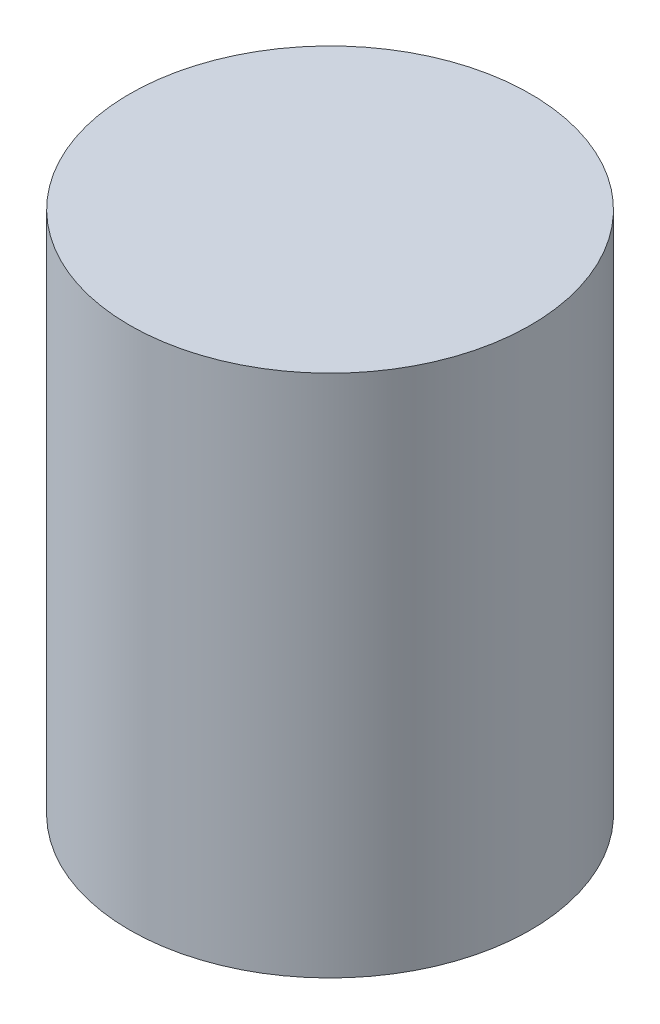
ISO-10303-21;
HEADER;
FILE_DESCRIPTION(('STEP AP214'),'2;1');
FILE_NAME('part.step','',(''),(''),'','','');
FILE_SCHEMA(('AUTOMOTIVE_DESIGN { 1 0 10303 214 1 1 1 1 }'));
ENDSEC;
DATA;
#1=APPLICATION_CONTEXT('core data for automotive mechanical design processes');
#2=APPLICATION_PROTOCOL_DEFINITION('international standard','automotive_design',2000,#1);
#3=PRODUCT_CONTEXT('',#1,'mechanical');
#4=PRODUCT('Part','Part','',(#3));
#5=PRODUCT_RELATED_PRODUCT_CATEGORY('part','',(#4));
#6=PRODUCT_DEFINITION_FORMATION('','',#4);
#7=PRODUCT_DEFINITION_CONTEXT('part definition',#1,'design');
#8=PRODUCT_DEFINITION('design','',#6,#7);
#9=PRODUCT_DEFINITION_SHAPE('','',#8);
#10=(LENGTH_UNIT() NAMED_UNIT(*) SI_UNIT(.MILLI.,.METRE.));
#11=(NAMED_UNIT(*) PLANE_ANGLE_UNIT() SI_UNIT($,.RADIAN.));
#12=(NAMED_UNIT(*) SI_UNIT($,.STERADIAN.) SOLID_ANGLE_UNIT());
#13=UNCERTAINTY_MEASURE_WITH_UNIT(LENGTH_MEASURE(1.E-05),#10,'distance_accuracy_value','');
#14=(GEOMETRIC_REPRESENTATION_CONTEXT(3) GLOBAL_UNCERTAINTY_ASSIGNED_CONTEXT((#13)) GLOBAL_UNIT_ASSIGNED_CONTEXT((#10,
#11,#12)) REPRESENTATION_CONTEXT('',''));
#15=CARTESIAN_POINT('',(0.,0.,0.));
#16=DIRECTION('',(0.,0.,1.));
#17=DIRECTION('',(1.,0.,0.));
#18=AXIS2_PLACEMENT_3D('',#15,#16,#17);
#19=CARTESIAN_POINT('',(0.,0.,0.));
#20=DIRECTION('',(0.,1.,0.));
#21=DIRECTION('',(0.,0.,1.));
#22=AXIS2_PLACEMENT_3D('',#19,#20,#21);
#23=PLANE('',#22);
#24=CARTESIAN_POINT('',(0.,0.,0.));
#25=DIRECTION('',(0.,1.,0.));
#26=DIRECTION('',(0.,0.,1.));
#27=AXIS2_PLACEMENT_3D('',#24,#25,#26);
#28=CIRCLE('',#27,19.05);
#29=CARTESIAN_POINT('',(0.,0.,19.05));
#30=VERTEX_POINT('',#29);
#31=EDGE_CURVE('E32',#30,#30,#28,.T.);
#32=ORIENTED_EDGE('',*,*,#31,.F.);
#33=EDGE_LOOP('',(#32));
#34=FACE_BOUND('',#33,.T.);
#35=CARTESIAN_POINT('',(0.,0.,0.));
#36=DIRECTION('',(0.,1.,0.));
#37=DIRECTION('',(0.,0.,1.));
#38=AXIS2_PLACEMENT_3D('',#35,#36,#37);
#39=CIRCLE('',#38,17.399);
#40=CARTESIAN_POINT('',(0.,0.,17.399));
#41=VERTEX_POINT('',#40);
#42=EDGE_CURVE('E41',#41,#41,#39,.T.);
#43=ORIENTED_EDGE('',*,*,#42,.T.);
#44=EDGE_LOOP('',(#43));
#45=FACE_BOUND('',#44,.T.);
#46=ADVANCED_FACE('F28',(#34,#45),#23,.F.);
#47=CARTESIAN_POINT('',(0.,49.784,0.));
#48=DIRECTION('',(0.,-1.,0.));
#49=DIRECTION('',(0.,0.,-1.));
#50=AXIS2_PLACEMENT_3D('',#47,#48,#49);
#51=CYLINDRICAL_SURFACE('',#50,19.05);
#52=CARTESIAN_POINT('',(0.,49.784,0.));
#53=DIRECTION('',(0.,1.,0.));
#54=DIRECTION('',(0.,0.,1.));
#55=AXIS2_PLACEMENT_3D('',#52,#53,#54);
#56=CIRCLE('',#55,19.05);
#57=CARTESIAN_POINT('',(0.,49.784,19.05));
#58=VERTEX_POINT('',#57);
#59=EDGE_CURVE('E10',#58,#58,#56,.T.);
#60=ORIENTED_EDGE('',*,*,#59,.F.);
#61=EDGE_LOOP('',(#60));
#62=FACE_BOUND('',#61,.T.);
#63=ORIENTED_EDGE('',*,*,#31,.T.);
#64=EDGE_LOOP('',(#63));
#65=FACE_BOUND('',#64,.T.);
#66=ADVANCED_FACE('F30',(#62,#65),#51,.T.);
#67=CARTESIAN_POINT('',(0.,49.784,0.));
#68=DIRECTION('',(0.,1.,0.));
#69=DIRECTION('',(0.,0.,1.));
#70=AXIS2_PLACEMENT_3D('',#67,#68,#69);
#71=PLANE('',#70);
#72=ORIENTED_EDGE('',*,*,#59,.T.);
#73=EDGE_LOOP('',(#72));
#74=FACE_BOUND('',#73,.T.);
#75=ADVANCED_FACE('F56',(#74),#71,.T.);
#76=CARTESIAN_POINT('',(0.,48.133,0.));
#77=DIRECTION('',(0.,-1.,0.));
#78=DIRECTION('',(0.,0.,-1.));
#79=AXIS2_PLACEMENT_3D('',#76,#77,#78);
#80=CYLINDRICAL_SURFACE('',#79,17.399);
#81=CARTESIAN_POINT('',(0.,48.133,0.));
#82=DIRECTION('',(0.,1.,0.));
#83=DIRECTION('',(0.,0.,1.));
#84=AXIS2_PLACEMENT_3D('',#81,#82,#83);
#85=CIRCLE('',#84,17.399);
#86=CARTESIAN_POINT('',(0.,48.133,17.399));
#87=VERTEX_POINT('',#86);
#88=EDGE_CURVE('E39',#87,#87,#85,.T.);
#89=ORIENTED_EDGE('',*,*,#88,.T.);
#90=EDGE_LOOP('',(#89));
#91=FACE_BOUND('',#90,.T.);
#92=ORIENTED_EDGE('',*,*,#42,.F.);
#93=EDGE_LOOP('',(#92));
#94=FACE_BOUND('',#93,.T.);
#95=ADVANCED_FACE('F47',(#91,#94),#80,.F.);
#96=CARTESIAN_POINT('',(0.,48.133,0.));
#97=DIRECTION('',(0.,1.,0.));
#98=DIRECTION('',(0.,0.,1.));
#99=AXIS2_PLACEMENT_3D('',#96,#97,#98);
#100=PLANE('',#99);
#101=ORIENTED_EDGE('',*,*,#88,.F.);
#102=EDGE_LOOP('',(#101));
#103=FACE_BOUND('',#102,.T.);
#104=ADVANCED_FACE('F50',(#103),#100,.F.);
#105=CLOSED_SHELL('',(#46,#66,#75,#95,#104));
#106=MANIFOLD_SOLID_BREP('B2',#105);
#107=ADVANCED_BREP_SHAPE_REPRESENTATION('',(#18,#106),#14);
#108=SHAPE_DEFINITION_REPRESENTATION(#9,#107);
ENDSEC;
END-ISO-10303-21;
